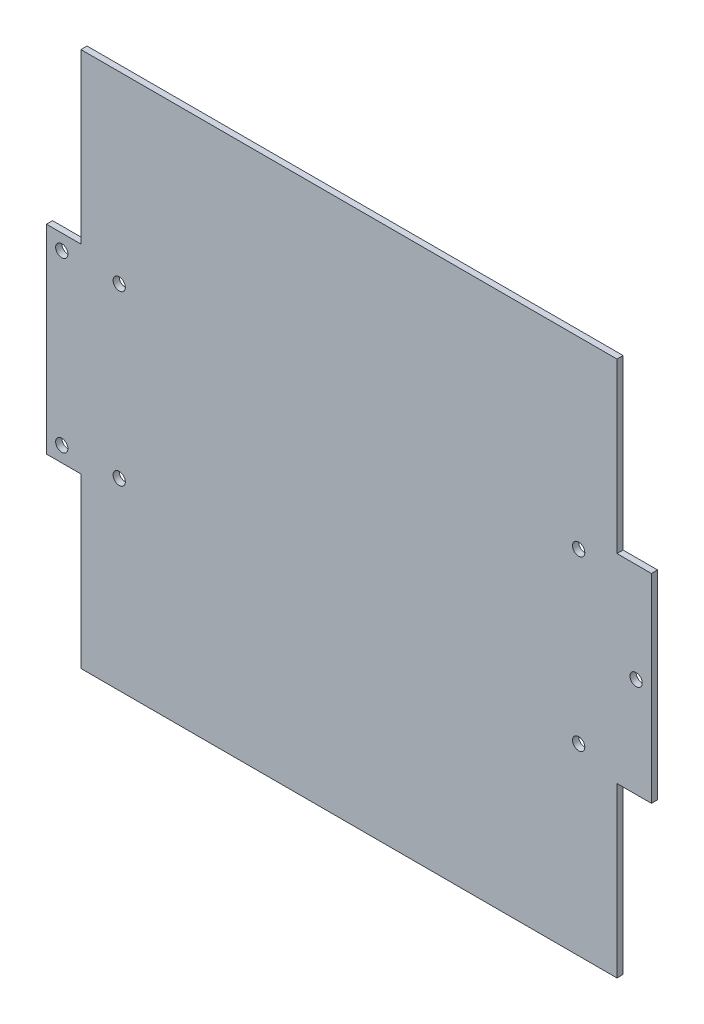
ISO-10303-21;
HEADER;
FILE_DESCRIPTION(('STEP AP214'),'2;1');
FILE_NAME('part.step','',(''),(''),'','','');
FILE_SCHEMA(('AUTOMOTIVE_DESIGN { 1 0 10303 214 1 1 1 1 }'));
ENDSEC;
DATA;
#1=APPLICATION_CONTEXT('core data for automotive mechanical design processes');
#2=APPLICATION_PROTOCOL_DEFINITION('international standard','automotive_design',2000,#1);
#3=PRODUCT_CONTEXT('',#1,'mechanical');
#4=PRODUCT('Part','Part','',(#3));
#5=PRODUCT_RELATED_PRODUCT_CATEGORY('part','',(#4));
#6=PRODUCT_DEFINITION_FORMATION('','',#4);
#7=PRODUCT_DEFINITION_CONTEXT('part definition',#1,'design');
#8=PRODUCT_DEFINITION('design','',#6,#7);
#9=PRODUCT_DEFINITION_SHAPE('','',#8);
#10=(LENGTH_UNIT() NAMED_UNIT(*) SI_UNIT(.MILLI.,.METRE.));
#11=(NAMED_UNIT(*) PLANE_ANGLE_UNIT() SI_UNIT($,.RADIAN.));
#12=(NAMED_UNIT(*) SI_UNIT($,.STERADIAN.) SOLID_ANGLE_UNIT());
#13=UNCERTAINTY_MEASURE_WITH_UNIT(LENGTH_MEASURE(1.E-05),#10,'distance_accuracy_value','');
#14=(GEOMETRIC_REPRESENTATION_CONTEXT(3) GLOBAL_UNCERTAINTY_ASSIGNED_CONTEXT((#13)) GLOBAL_UNIT_ASSIGNED_CONTEXT((#10,
#11,#12)) REPRESENTATION_CONTEXT('',''));
#15=CARTESIAN_POINT('',(0.,0.,0.));
#16=DIRECTION('',(0.,0.,1.));
#17=DIRECTION('',(1.,0.,0.));
#18=AXIS2_PLACEMENT_3D('',#15,#16,#17);
#19=CARTESIAN_POINT('',(0.,0.,1.6));
#20=DIRECTION('',(1.,0.,0.));
#21=DIRECTION('',(0.,1.,0.));
#22=AXIS2_PLACEMENT_3D('',#19,#20,#21);
#23=PLANE('',#22);
#24=DIRECTION('',(0.,-1.,0.));
#25=VECTOR('',#24,1.);
#26=CARTESIAN_POINT('',(0.,0.,0.));
#27=LINE('',#26,#25);
#28=CARTESIAN_POINT('',(0.,44.,0.));
#29=VERTEX_POINT('',#28);
#30=CARTESIAN_POINT('',(0.,0.,0.));
#31=VERTEX_POINT('',#30);
#32=EDGE_CURVE('E155',#29,#31,#27,.T.);
#33=ORIENTED_EDGE('',*,*,#32,.T.);
#34=DIRECTION('',(0.,0.,-1.));
#35=VECTOR('',#34,1.);
#36=CARTESIAN_POINT('',(0.,0.,1.6));
#37=LINE('',#36,#35);
#38=CARTESIAN_POINT('',(0.,0.,1.6));
#39=VERTEX_POINT('',#38);
#40=EDGE_CURVE('E11',#39,#31,#37,.T.);
#41=ORIENTED_EDGE('',*,*,#40,.F.);
#42=DIRECTION('',(0.,-1.,0.));
#43=VECTOR('',#42,1.);
#44=CARTESIAN_POINT('',(0.,0.,1.6));
#45=LINE('',#44,#43);
#46=CARTESIAN_POINT('',(0.,44.,1.6));
#47=VERTEX_POINT('',#46);
#48=EDGE_CURVE('E178',#47,#39,#45,.T.);
#49=ORIENTED_EDGE('',*,*,#48,.F.);
#50=DIRECTION('',(0.,0.,-1.));
#51=VECTOR('',#50,1.);
#52=CARTESIAN_POINT('',(0.,44.,1.6));
#53=LINE('',#52,#51);
#54=EDGE_CURVE('E151',#47,#29,#53,.T.);
#55=ORIENTED_EDGE('',*,*,#54,.T.);
#56=EDGE_LOOP('',(#33,#41,#49,#55));
#57=FACE_BOUND('',#56,.T.);
#58=ADVANCED_FACE('F35',(#57),#23,.F.);
#59=CARTESIAN_POINT('',(0.,0.,1.6));
#60=DIRECTION('',(0.,1.,0.));
#61=DIRECTION('',(-1.,0.,0.));
#62=AXIS2_PLACEMENT_3D('',#59,#60,#61);
#63=PLANE('',#62);
#64=DIRECTION('',(1.,0.,0.));
#65=VECTOR('',#64,1.);
#66=CARTESIAN_POINT('',(0.,0.,0.));
#67=LINE('',#66,#65);
#68=CARTESIAN_POINT('',(140.,0.,0.));
#69=VERTEX_POINT('',#68);
#70=EDGE_CURVE('E158',#31,#69,#67,.T.);
#71=ORIENTED_EDGE('',*,*,#70,.T.);
#72=DIRECTION('',(0.,0.,-1.));
#73=VECTOR('',#72,1.);
#74=CARTESIAN_POINT('',(140.,0.,1.6));
#75=LINE('',#74,#73);
#76=CARTESIAN_POINT('',(140.,0.,1.6));
#77=VERTEX_POINT('',#76);
#78=EDGE_CURVE('E43',#77,#69,#75,.T.);
#79=ORIENTED_EDGE('',*,*,#78,.F.);
#80=DIRECTION('',(1.,0.,0.));
#81=VECTOR('',#80,1.);
#82=CARTESIAN_POINT('',(0.,0.,1.6));
#83=LINE('',#82,#81);
#84=EDGE_CURVE('E106',#39,#77,#83,.T.);
#85=ORIENTED_EDGE('',*,*,#84,.F.);
#86=ORIENTED_EDGE('',*,*,#40,.T.);
#87=EDGE_LOOP('',(#71,#79,#85,#86));
#88=FACE_BOUND('',#87,.T.);
#89=ADVANCED_FACE('F257',(#88),#63,.F.);
#90=CARTESIAN_POINT('',(140.,0.,1.6));
#91=DIRECTION('',(-1.,0.,0.));
#92=DIRECTION('',(0.,0.,1.));
#93=AXIS2_PLACEMENT_3D('',#90,#91,#92);
#94=PLANE('',#93);
#95=DIRECTION('',(0.,1.,0.));
#96=VECTOR('',#95,1.);
#97=CARTESIAN_POINT('',(140.,0.,0.));
#98=LINE('',#97,#96);
#99=CARTESIAN_POINT('',(140.,44.,0.));
#100=VERTEX_POINT('',#99);
#101=EDGE_CURVE('E161',#69,#100,#98,.T.);
#102=ORIENTED_EDGE('',*,*,#101,.T.);
#103=DIRECTION('',(0.,0.,-1.));
#104=VECTOR('',#103,1.);
#105=CARTESIAN_POINT('',(140.,44.,1.6));
#106=LINE('',#105,#104);
#107=CARTESIAN_POINT('',(140.,44.,1.6));
#108=VERTEX_POINT('',#107);
#109=EDGE_CURVE('E197',#108,#100,#106,.T.);
#110=ORIENTED_EDGE('',*,*,#109,.F.);
#111=DIRECTION('',(0.,1.,0.));
#112=VECTOR('',#111,1.);
#113=CARTESIAN_POINT('',(140.,0.,1.6));
#114=LINE('',#113,#112);
#115=EDGE_CURVE('E205',#77,#108,#114,.T.);
#116=ORIENTED_EDGE('',*,*,#115,.F.);
#117=ORIENTED_EDGE('',*,*,#78,.T.);
#118=EDGE_LOOP('',(#102,#110,#116,#117));
#119=FACE_BOUND('',#118,.T.);
#120=ADVANCED_FACE('F203',(#119),#94,.F.);
#121=CARTESIAN_POINT('',(140.,44.,1.6));
#122=DIRECTION('',(0.,1.,0.));
#123=DIRECTION('',(-1.,0.,0.));
#124=AXIS2_PLACEMENT_3D('',#121,#122,#123);
#125=PLANE('',#124);
#126=DIRECTION('',(1.,0.,0.));
#127=VECTOR('',#126,1.);
#128=CARTESIAN_POINT('',(140.,44.,0.));
#129=LINE('',#128,#127);
#130=CARTESIAN_POINT('',(149.,44.,0.));
#131=VERTEX_POINT('',#130);
#132=EDGE_CURVE('E163',#100,#131,#129,.T.);
#133=ORIENTED_EDGE('',*,*,#132,.T.);
#134=DIRECTION('',(0.,0.,-1.));
#135=VECTOR('',#134,1.);
#136=CARTESIAN_POINT('',(149.,44.,1.6));
#137=LINE('',#136,#135);
#138=CARTESIAN_POINT('',(149.,44.,1.6));
#139=VERTEX_POINT('',#138);
#140=EDGE_CURVE('E194',#139,#131,#137,.T.);
#141=ORIENTED_EDGE('',*,*,#140,.F.);
#142=DIRECTION('',(1.,0.,0.));
#143=VECTOR('',#142,1.);
#144=CARTESIAN_POINT('',(140.,44.,1.6));
#145=LINE('',#144,#143);
#146=EDGE_CURVE('E223',#108,#139,#145,.T.);
#147=ORIENTED_EDGE('',*,*,#146,.F.);
#148=ORIENTED_EDGE('',*,*,#109,.T.);
#149=EDGE_LOOP('',(#133,#141,#147,#148));
#150=FACE_BOUND('',#149,.T.);
#151=ADVANCED_FACE('F214',(#150),#125,.F.);
#152=CARTESIAN_POINT('',(149.,44.,1.6));
#153=DIRECTION('',(-1.,0.,0.));
#154=DIRECTION('',(0.,0.,1.));
#155=AXIS2_PLACEMENT_3D('',#152,#153,#154);
#156=PLANE('',#155);
#157=DIRECTION('',(0.,1.,0.));
#158=VECTOR('',#157,1.);
#159=CARTESIAN_POINT('',(149.,44.,0.));
#160=LINE('',#159,#158);
#161=CARTESIAN_POINT('',(149.,96.,0.));
#162=VERTEX_POINT('',#161);
#163=EDGE_CURVE('E165',#131,#162,#160,.T.);
#164=ORIENTED_EDGE('',*,*,#163,.T.);
#165=DIRECTION('',(0.,0.,-1.));
#166=VECTOR('',#165,1.);
#167=CARTESIAN_POINT('',(149.,96.,1.6));
#168=LINE('',#167,#166);
#169=CARTESIAN_POINT('',(149.,96.,1.6));
#170=VERTEX_POINT('',#169);
#171=EDGE_CURVE('E191',#170,#162,#168,.T.);
#172=ORIENTED_EDGE('',*,*,#171,.F.);
#173=DIRECTION('',(0.,1.,0.));
#174=VECTOR('',#173,1.);
#175=CARTESIAN_POINT('',(149.,44.,1.6));
#176=LINE('',#175,#174);
#177=EDGE_CURVE('E220',#139,#170,#176,.T.);
#178=ORIENTED_EDGE('',*,*,#177,.F.);
#179=ORIENTED_EDGE('',*,*,#140,.T.);
#180=EDGE_LOOP('',(#164,#172,#178,#179));
#181=FACE_BOUND('',#180,.T.);
#182=ADVANCED_FACE('F218',(#181),#156,.F.);
#183=CARTESIAN_POINT('',(149.,96.,1.6));
#184=DIRECTION('',(0.,-1.,0.));
#185=DIRECTION('',(0.,0.,-1.));
#186=AXIS2_PLACEMENT_3D('',#183,#184,#185);
#187=PLANE('',#186);
#188=DIRECTION('',(-1.,0.,0.));
#189=VECTOR('',#188,1.);
#190=CARTESIAN_POINT('',(149.,96.,0.));
#191=LINE('',#190,#189);
#192=CARTESIAN_POINT('',(140.,96.,0.));
#193=VERTEX_POINT('',#192);
#194=EDGE_CURVE('E167',#162,#193,#191,.T.);
#195=ORIENTED_EDGE('',*,*,#194,.T.);
#196=DIRECTION('',(0.,0.,-1.));
#197=VECTOR('',#196,1.);
#198=CARTESIAN_POINT('',(140.,96.,1.6));
#199=LINE('',#198,#197);
#200=CARTESIAN_POINT('',(140.,96.,1.6));
#201=VERTEX_POINT('',#200);
#202=EDGE_CURVE('E188',#201,#193,#199,.T.);
#203=ORIENTED_EDGE('',*,*,#202,.F.);
#204=DIRECTION('',(-1.,0.,0.));
#205=VECTOR('',#204,1.);
#206=CARTESIAN_POINT('',(149.,96.,1.6));
#207=LINE('',#206,#205);
#208=EDGE_CURVE('E222',#170,#201,#207,.T.);
#209=ORIENTED_EDGE('',*,*,#208,.F.);
#210=ORIENTED_EDGE('',*,*,#171,.T.);
#211=EDGE_LOOP('',(#195,#203,#209,#210));
#212=FACE_BOUND('',#211,.T.);
#213=ADVANCED_FACE('F270',(#212),#187,.F.);
#214=CARTESIAN_POINT('',(140.,96.,1.6));
#215=DIRECTION('',(-1.,0.,0.));
#216=DIRECTION('',(0.,-1.,0.));
#217=AXIS2_PLACEMENT_3D('',#214,#215,#216);
#218=PLANE('',#217);
#219=DIRECTION('',(0.,1.,0.));
#220=VECTOR('',#219,1.);
#221=CARTESIAN_POINT('',(140.,96.,0.));
#222=LINE('',#221,#220);
#223=CARTESIAN_POINT('',(140.,140.,0.));
#224=VERTEX_POINT('',#223);
#225=EDGE_CURVE('E169',#193,#224,#222,.T.);
#226=ORIENTED_EDGE('',*,*,#225,.T.);
#227=DIRECTION('',(0.,0.,-1.));
#228=VECTOR('',#227,1.);
#229=CARTESIAN_POINT('',(140.,140.,1.6));
#230=LINE('',#229,#228);
#231=CARTESIAN_POINT('',(140.,140.,1.6));
#232=VERTEX_POINT('',#231);
#233=EDGE_CURVE('E185',#232,#224,#230,.T.);
#234=ORIENTED_EDGE('',*,*,#233,.F.);
#235=DIRECTION('',(0.,1.,0.));
#236=VECTOR('',#235,1.);
#237=CARTESIAN_POINT('',(140.,96.,1.6));
#238=LINE('',#237,#236);
#239=EDGE_CURVE('E225',#201,#232,#238,.T.);
#240=ORIENTED_EDGE('',*,*,#239,.F.);
#241=ORIENTED_EDGE('',*,*,#202,.T.);
#242=EDGE_LOOP('',(#226,#234,#240,#241));
#243=FACE_BOUND('',#242,.T.);
#244=ADVANCED_FACE('F273',(#243),#218,.F.);
#245=CARTESIAN_POINT('',(0.,140.,1.6));
#246=DIRECTION('',(0.,-1.,0.));
#247=DIRECTION('',(0.,0.,-1.));
#248=AXIS2_PLACEMENT_3D('',#245,#246,#247);
#249=PLANE('',#248);
#250=DIRECTION('',(-1.,0.,0.));
#251=VECTOR('',#250,1.);
#252=CARTESIAN_POINT('',(0.,140.,0.));
#253=LINE('',#252,#251);
#254=CARTESIAN_POINT('',(0.,140.,0.));
#255=VERTEX_POINT('',#254);
#256=EDGE_CURVE('E171',#224,#255,#253,.T.);
#257=ORIENTED_EDGE('',*,*,#256,.T.);
#258=DIRECTION('',(0.,0.,-1.));
#259=VECTOR('',#258,1.);
#260=CARTESIAN_POINT('',(0.,140.,1.6));
#261=LINE('',#260,#259);
#262=CARTESIAN_POINT('',(0.,140.,1.6));
#263=VERTEX_POINT('',#262);
#264=EDGE_CURVE('E182',#263,#255,#261,.T.);
#265=ORIENTED_EDGE('',*,*,#264,.F.);
#266=DIRECTION('',(-1.,0.,0.));
#267=VECTOR('',#266,1.);
#268=CARTESIAN_POINT('',(0.,140.,1.6));
#269=LINE('',#268,#267);
#270=EDGE_CURVE('E231',#232,#263,#269,.T.);
#271=ORIENTED_EDGE('',*,*,#270,.F.);
#272=ORIENTED_EDGE('',*,*,#233,.T.);
#273=EDGE_LOOP('',(#257,#265,#271,#272));
#274=FACE_BOUND('',#273,.T.);
#275=ADVANCED_FACE('F237',(#274),#249,.F.);
#276=CARTESIAN_POINT('',(0.,96.,1.6));
#277=DIRECTION('',(1.,0.,0.));
#278=DIRECTION('',(0.,0.,-1.));
#279=AXIS2_PLACEMENT_3D('',#276,#277,#278);
#280=PLANE('',#279);
#281=DIRECTION('',(0.,-1.,0.));
#282=VECTOR('',#281,1.);
#283=CARTESIAN_POINT('',(0.,96.,0.));
#284=LINE('',#283,#282);
#285=CARTESIAN_POINT('',(0.,96.,0.));
#286=VERTEX_POINT('',#285);
#287=EDGE_CURVE('E173',#255,#286,#284,.T.);
#288=ORIENTED_EDGE('',*,*,#287,.T.);
#289=DIRECTION('',(0.,0.,-1.));
#290=VECTOR('',#289,1.);
#291=CARTESIAN_POINT('',(0.,96.,1.6));
#292=LINE('',#291,#290);
#293=CARTESIAN_POINT('',(0.,96.,1.6));
#294=VERTEX_POINT('',#293);
#295=EDGE_CURVE('E146',#294,#286,#292,.T.);
#296=ORIENTED_EDGE('',*,*,#295,.F.);
#297=DIRECTION('',(0.,-1.,0.));
#298=VECTOR('',#297,1.);
#299=CARTESIAN_POINT('',(0.,96.,1.6));
#300=LINE('',#299,#298);
#301=EDGE_CURVE('E137',#263,#294,#300,.T.);
#302=ORIENTED_EDGE('',*,*,#301,.F.);
#303=ORIENTED_EDGE('',*,*,#264,.T.);
#304=EDGE_LOOP('',(#288,#296,#302,#303));
#305=FACE_BOUND('',#304,.T.);
#306=ADVANCED_FACE('F241',(#305),#280,.F.);
#307=CARTESIAN_POINT('',(0.,96.,1.6));
#308=DIRECTION('',(0.,-1.,0.));
#309=DIRECTION('',(1.,0.,0.));
#310=AXIS2_PLACEMENT_3D('',#307,#308,#309);
#311=PLANE('',#310);
#312=DIRECTION('',(-1.,0.,0.));
#313=VECTOR('',#312,1.);
#314=CARTESIAN_POINT('',(0.,96.,0.));
#315=LINE('',#314,#313);
#316=CARTESIAN_POINT('',(-9.,96.,0.));
#317=VERTEX_POINT('',#316);
#318=EDGE_CURVE('E145',#286,#317,#315,.T.);
#319=ORIENTED_EDGE('',*,*,#318,.T.);
#320=DIRECTION('',(0.,0.,-1.));
#321=VECTOR('',#320,1.);
#322=CARTESIAN_POINT('',(-9.,96.,1.6));
#323=LINE('',#322,#321);
#324=CARTESIAN_POINT('',(-9.,96.,1.6));
#325=VERTEX_POINT('',#324);
#326=EDGE_CURVE('E142',#325,#317,#323,.T.);
#327=ORIENTED_EDGE('',*,*,#326,.F.);
#328=DIRECTION('',(-1.,0.,0.));
#329=VECTOR('',#328,1.);
#330=CARTESIAN_POINT('',(0.,96.,1.6));
#331=LINE('',#330,#329);
#332=EDGE_CURVE('E131',#294,#325,#331,.T.);
#333=ORIENTED_EDGE('',*,*,#332,.F.);
#334=ORIENTED_EDGE('',*,*,#295,.T.);
#335=EDGE_LOOP('',(#319,#327,#333,#334));
#336=FACE_BOUND('',#335,.T.);
#337=ADVANCED_FACE('F143',(#336),#311,.F.);
#338=CARTESIAN_POINT('',(-9.,96.,1.6));
#339=DIRECTION('',(1.,0.,0.));
#340=DIRECTION('',(0.,1.,0.));
#341=AXIS2_PLACEMENT_3D('',#338,#339,#340);
#342=PLANE('',#341);
#343=DIRECTION('',(0.,-1.,0.));
#344=VECTOR('',#343,1.);
#345=CARTESIAN_POINT('',(-9.,96.,0.));
#346=LINE('',#345,#344);
#347=CARTESIAN_POINT('',(-8.99999999999999,44.,0.));
#348=VERTEX_POINT('',#347);
#349=EDGE_CURVE('E92',#317,#348,#346,.T.);
#350=ORIENTED_EDGE('',*,*,#349,.T.);
#351=DIRECTION('',(0.,0.,-1.));
#352=VECTOR('',#351,1.);
#353=CARTESIAN_POINT('',(-8.99999999999999,44.,1.6));
#354=LINE('',#353,#352);
#355=CARTESIAN_POINT('',(-8.99999999999999,44.,1.6));
#356=VERTEX_POINT('',#355);
#357=EDGE_CURVE('E147',#356,#348,#354,.T.);
#358=ORIENTED_EDGE('',*,*,#357,.F.);
#359=DIRECTION('',(0.,-1.,0.));
#360=VECTOR('',#359,1.);
#361=CARTESIAN_POINT('',(-9.,96.,1.6));
#362=LINE('',#361,#360);
#363=EDGE_CURVE('E135',#325,#356,#362,.T.);
#364=ORIENTED_EDGE('',*,*,#363,.F.);
#365=ORIENTED_EDGE('',*,*,#326,.T.);
#366=EDGE_LOOP('',(#350,#358,#364,#365));
#367=FACE_BOUND('',#366,.T.);
#368=ADVANCED_FACE('F149',(#367),#342,.F.);
#369=CARTESIAN_POINT('',(-8.99999999999999,44.,1.6));
#370=DIRECTION('',(0.,1.,0.));
#371=DIRECTION('',(-1.,0.,0.));
#372=AXIS2_PLACEMENT_3D('',#369,#370,#371);
#373=PLANE('',#372);
#374=DIRECTION('',(1.,0.,0.));
#375=VECTOR('',#374,1.);
#376=CARTESIAN_POINT('',(-8.99999999999999,44.,0.));
#377=LINE('',#376,#375);
#378=EDGE_CURVE('E98',#348,#29,#377,.T.);
#379=ORIENTED_EDGE('',*,*,#378,.T.);
#380=ORIENTED_EDGE('',*,*,#54,.F.);
#381=DIRECTION('',(1.,0.,0.));
#382=VECTOR('',#381,1.);
#383=CARTESIAN_POINT('',(-8.99999999999999,44.,1.6));
#384=LINE('',#383,#382);
#385=EDGE_CURVE('E51',#356,#47,#384,.T.);
#386=ORIENTED_EDGE('',*,*,#385,.F.);
#387=ORIENTED_EDGE('',*,*,#357,.T.);
#388=EDGE_LOOP('',(#379,#380,#386,#387));
#389=FACE_BOUND('',#388,.T.);
#390=ADVANCED_FACE('F245',(#389),#373,.F.);
#391=CARTESIAN_POINT('',(0.,44.,1.6));
#392=DIRECTION('',(0.,0.,-1.));
#393=DIRECTION('',(-1.,0.,0.));
#394=AXIS2_PLACEMENT_3D('',#391,#392,#393);
#395=PLANE('',#394);
#396=CARTESIAN_POINT('',(145.,70.,1.6));
#397=DIRECTION('',(0.,0.,1.));
#398=DIRECTION('',(1.,0.,0.));
#399=AXIS2_PLACEMENT_3D('',#396,#397,#398);
#400=CIRCLE('',#399,1.59999999999999);
#401=CARTESIAN_POINT('',(146.6,70.,1.6));
#402=VERTEX_POINT('',#401);
#403=EDGE_CURVE('E389',#402,#402,#400,.T.);
#404=ORIENTED_EDGE('',*,*,#403,.F.);
#405=EDGE_LOOP('',(#404));
#406=FACE_BOUND('',#405,.T.);
#407=CARTESIAN_POINT('',(-4.99999999999996,48.,1.6));
#408=DIRECTION('',(0.,0.,1.));
#409=DIRECTION('',(1.,0.,0.));
#410=AXIS2_PLACEMENT_3D('',#407,#408,#409);
#411=CIRCLE('',#410,1.6);
#412=CARTESIAN_POINT('',(-3.39999999999996,48.,1.6));
#413=VERTEX_POINT('',#412);
#414=EDGE_CURVE('E391',#413,#413,#411,.T.);
#415=ORIENTED_EDGE('',*,*,#414,.F.);
#416=EDGE_LOOP('',(#415));
#417=FACE_BOUND('',#416,.T.);
#418=CARTESIAN_POINT('',(-4.99999999999997,92.,1.6));
#419=DIRECTION('',(0.,0.,1.));
#420=DIRECTION('',(1.,0.,0.));
#421=AXIS2_PLACEMENT_3D('',#418,#419,#420);
#422=CIRCLE('',#421,1.6);
#423=CARTESIAN_POINT('',(-3.39999999999997,92.,1.6));
#424=VERTEX_POINT('',#423);
#425=EDGE_CURVE('E397',#424,#424,#422,.T.);
#426=ORIENTED_EDGE('',*,*,#425,.F.);
#427=EDGE_LOOP('',(#426));
#428=FACE_BOUND('',#427,.T.);
#429=CARTESIAN_POINT('',(130.,92.,1.6));
#430=DIRECTION('',(0.,0.,-1.));
#431=DIRECTION('',(-1.,0.,0.));
#432=AXIS2_PLACEMENT_3D('',#429,#430,#431);
#433=CIRCLE('',#432,1.59999999999999);
#434=CARTESIAN_POINT('',(128.4,92.,1.6));
#435=VERTEX_POINT('',#434);
#436=EDGE_CURVE('E408',#435,#435,#433,.T.);
#437=ORIENTED_EDGE('',*,*,#436,.T.);
#438=EDGE_LOOP('',(#437));
#439=FACE_BOUND('',#438,.T.);
#440=CARTESIAN_POINT('',(130.,48.,1.6));
#441=DIRECTION('',(0.,0.,-1.));
#442=DIRECTION('',(-1.,0.,0.));
#443=AXIS2_PLACEMENT_3D('',#440,#441,#442);
#444=CIRCLE('',#443,1.59999999999999);
#445=CARTESIAN_POINT('',(128.4,48.,1.6));
#446=VERTEX_POINT('',#445);
#447=EDGE_CURVE('E414',#446,#446,#444,.T.);
#448=ORIENTED_EDGE('',*,*,#447,.T.);
#449=EDGE_LOOP('',(#448));
#450=FACE_BOUND('',#449,.T.);
#451=CARTESIAN_POINT('',(10.,92.,1.6));
#452=DIRECTION('',(0.,0.,-1.));
#453=DIRECTION('',(-1.,0.,0.));
#454=AXIS2_PLACEMENT_3D('',#451,#452,#453);
#455=CIRCLE('',#454,1.6);
#456=CARTESIAN_POINT('',(8.40000000000005,92.,1.6));
#457=VERTEX_POINT('',#456);
#458=EDGE_CURVE('E420',#457,#457,#455,.T.);
#459=ORIENTED_EDGE('',*,*,#458,.T.);
#460=EDGE_LOOP('',(#459));
#461=FACE_BOUND('',#460,.T.);
#462=CARTESIAN_POINT('',(10.,48.,1.6));
#463=DIRECTION('',(0.,0.,-1.));
#464=DIRECTION('',(-1.,0.,0.));
#465=AXIS2_PLACEMENT_3D('',#462,#463,#464);
#466=CIRCLE('',#465,1.6);
#467=CARTESIAN_POINT('',(8.40000000000004,48.,1.6));
#468=VERTEX_POINT('',#467);
#469=EDGE_CURVE('E159',#468,#468,#466,.T.);
#470=ORIENTED_EDGE('',*,*,#469,.T.);
#471=EDGE_LOOP('',(#470));
#472=FACE_BOUND('',#471,.T.);
#473=ORIENTED_EDGE('',*,*,#48,.T.);
#474=ORIENTED_EDGE('',*,*,#84,.T.);
#475=ORIENTED_EDGE('',*,*,#115,.T.);
#476=ORIENTED_EDGE('',*,*,#146,.T.);
#477=ORIENTED_EDGE('',*,*,#177,.T.);
#478=ORIENTED_EDGE('',*,*,#208,.T.);
#479=ORIENTED_EDGE('',*,*,#239,.T.);
#480=ORIENTED_EDGE('',*,*,#270,.T.);
#481=ORIENTED_EDGE('',*,*,#301,.T.);
#482=ORIENTED_EDGE('',*,*,#332,.T.);
#483=ORIENTED_EDGE('',*,*,#363,.T.);
#484=ORIENTED_EDGE('',*,*,#385,.T.);
#485=EDGE_LOOP('',(#473,#474,#475,#476,#477,#478,#479,#480,#481,#482,#483,#484));
#486=FACE_BOUND('',#485,.T.);
#487=ADVANCED_FACE('F133',(#406,#417,#428,#439,#450,#461,#472,#486),#395,.F.);
#488=CARTESIAN_POINT('',(0.,44.,0.));
#489=DIRECTION('',(0.,0.,-1.));
#490=DIRECTION('',(-1.,0.,0.));
#491=AXIS2_PLACEMENT_3D('',#488,#489,#490);
#492=PLANE('',#491);
#493=CARTESIAN_POINT('',(145.,70.,0.));
#494=DIRECTION('',(0.,0.,1.));
#495=DIRECTION('',(1.,0.,0.));
#496=AXIS2_PLACEMENT_3D('',#493,#494,#495);
#497=CIRCLE('',#496,1.59999999999999);
#498=CARTESIAN_POINT('',(146.6,70.,0.));
#499=VERTEX_POINT('',#498);
#500=EDGE_CURVE('E386',#499,#499,#497,.T.);
#501=ORIENTED_EDGE('',*,*,#500,.T.);
#502=EDGE_LOOP('',(#501));
#503=FACE_BOUND('',#502,.T.);
#504=CARTESIAN_POINT('',(-4.99999999999996,48.,0.));
#505=DIRECTION('',(0.,0.,1.));
#506=DIRECTION('',(1.,0.,0.));
#507=AXIS2_PLACEMENT_3D('',#504,#505,#506);
#508=CIRCLE('',#507,1.6);
#509=CARTESIAN_POINT('',(-3.39999999999996,48.,0.));
#510=VERTEX_POINT('',#509);
#511=EDGE_CURVE('E394',#510,#510,#508,.T.);
#512=ORIENTED_EDGE('',*,*,#511,.T.);
#513=EDGE_LOOP('',(#512));
#514=FACE_BOUND('',#513,.T.);
#515=CARTESIAN_POINT('',(-4.99999999999997,92.,0.));
#516=DIRECTION('',(0.,0.,1.));
#517=DIRECTION('',(1.,0.,0.));
#518=AXIS2_PLACEMENT_3D('',#515,#516,#517);
#519=CIRCLE('',#518,1.6);
#520=CARTESIAN_POINT('',(-3.39999999999997,92.,0.));
#521=VERTEX_POINT('',#520);
#522=EDGE_CURVE('E400',#521,#521,#519,.T.);
#523=ORIENTED_EDGE('',*,*,#522,.T.);
#524=EDGE_LOOP('',(#523));
#525=FACE_BOUND('',#524,.T.);
#526=CARTESIAN_POINT('',(130.,92.,0.));
#527=DIRECTION('',(0.,0.,-1.));
#528=DIRECTION('',(-1.,0.,0.));
#529=AXIS2_PLACEMENT_3D('',#526,#527,#528);
#530=CIRCLE('',#529,1.59999999999999);
#531=CARTESIAN_POINT('',(128.4,92.,0.));
#532=VERTEX_POINT('',#531);
#533=EDGE_CURVE('E403',#532,#532,#530,.T.);
#534=ORIENTED_EDGE('',*,*,#533,.F.);
#535=EDGE_LOOP('',(#534));
#536=FACE_BOUND('',#535,.T.);
#537=CARTESIAN_POINT('',(130.,48.,0.));
#538=DIRECTION('',(0.,0.,-1.));
#539=DIRECTION('',(-1.,0.,0.));
#540=AXIS2_PLACEMENT_3D('',#537,#538,#539);
#541=CIRCLE('',#540,1.59999999999999);
#542=CARTESIAN_POINT('',(128.4,48.,0.));
#543=VERTEX_POINT('',#542);
#544=EDGE_CURVE('E411',#543,#543,#541,.T.);
#545=ORIENTED_EDGE('',*,*,#544,.F.);
#546=EDGE_LOOP('',(#545));
#547=FACE_BOUND('',#546,.T.);
#548=CARTESIAN_POINT('',(10.,92.,0.));
#549=DIRECTION('',(0.,0.,-1.));
#550=DIRECTION('',(-1.,0.,0.));
#551=AXIS2_PLACEMENT_3D('',#548,#549,#550);
#552=CIRCLE('',#551,1.6);
#553=CARTESIAN_POINT('',(8.40000000000005,92.,0.));
#554=VERTEX_POINT('',#553);
#555=EDGE_CURVE('E417',#554,#554,#552,.T.);
#556=ORIENTED_EDGE('',*,*,#555,.F.);
#557=EDGE_LOOP('',(#556));
#558=FACE_BOUND('',#557,.T.);
#559=CARTESIAN_POINT('',(10.,48.,0.));
#560=DIRECTION('',(0.,0.,-1.));
#561=DIRECTION('',(-1.,0.,0.));
#562=AXIS2_PLACEMENT_3D('',#559,#560,#561);
#563=CIRCLE('',#562,1.6);
#564=CARTESIAN_POINT('',(8.40000000000004,48.,0.));
#565=VERTEX_POINT('',#564);
#566=EDGE_CURVE('E423',#565,#565,#563,.T.);
#567=ORIENTED_EDGE('',*,*,#566,.F.);
#568=EDGE_LOOP('',(#567));
#569=FACE_BOUND('',#568,.T.);
#570=ORIENTED_EDGE('',*,*,#32,.F.);
#571=ORIENTED_EDGE('',*,*,#378,.F.);
#572=ORIENTED_EDGE('',*,*,#349,.F.);
#573=ORIENTED_EDGE('',*,*,#318,.F.);
#574=ORIENTED_EDGE('',*,*,#287,.F.);
#575=ORIENTED_EDGE('',*,*,#256,.F.);
#576=ORIENTED_EDGE('',*,*,#225,.F.);
#577=ORIENTED_EDGE('',*,*,#194,.F.);
#578=ORIENTED_EDGE('',*,*,#163,.F.);
#579=ORIENTED_EDGE('',*,*,#132,.F.);
#580=ORIENTED_EDGE('',*,*,#101,.F.);
#581=ORIENTED_EDGE('',*,*,#70,.F.);
#582=EDGE_LOOP('',(#570,#571,#572,#573,#574,#575,#576,#577,#578,#579,#580,#581));
#583=FACE_BOUND('',#582,.T.);
#584=ADVANCED_FACE('F209',(#503,#514,#525,#536,#547,#558,#569,#583),#492,.T.);
#585=CARTESIAN_POINT('',(10.,48.,0.));
#586=DIRECTION('',(0.,0.,-1.));
#587=DIRECTION('',(-1.,0.,0.));
#588=AXIS2_PLACEMENT_3D('',#585,#586,#587);
#589=CYLINDRICAL_SURFACE('',#588,1.6);
#590=ORIENTED_EDGE('',*,*,#566,.T.);
#591=EDGE_LOOP('',(#590));
#592=FACE_BOUND('',#591,.T.);
#593=ORIENTED_EDGE('',*,*,#469,.F.);
#594=EDGE_LOOP('',(#593));
#595=FACE_BOUND('',#594,.T.);
#596=ADVANCED_FACE('F301',(#592,#595),#589,.F.);
#597=CARTESIAN_POINT('',(10.,92.,0.));
#598=DIRECTION('',(0.,0.,-1.));
#599=DIRECTION('',(-1.,0.,0.));
#600=AXIS2_PLACEMENT_3D('',#597,#598,#599);
#601=CYLINDRICAL_SURFACE('',#600,1.6);
#602=ORIENTED_EDGE('',*,*,#555,.T.);
#603=EDGE_LOOP('',(#602));
#604=FACE_BOUND('',#603,.T.);
#605=ORIENTED_EDGE('',*,*,#458,.F.);
#606=EDGE_LOOP('',(#605));
#607=FACE_BOUND('',#606,.T.);
#608=ADVANCED_FACE('F306',(#604,#607),#601,.F.);
#609=CARTESIAN_POINT('',(130.,48.,0.));
#610=DIRECTION('',(0.,0.,-1.));
#611=DIRECTION('',(-1.,0.,0.));
#612=AXIS2_PLACEMENT_3D('',#609,#610,#611);
#613=CYLINDRICAL_SURFACE('',#612,1.59999999999999);
#614=ORIENTED_EDGE('',*,*,#544,.T.);
#615=EDGE_LOOP('',(#614));
#616=FACE_BOUND('',#615,.T.);
#617=ORIENTED_EDGE('',*,*,#447,.F.);
#618=EDGE_LOOP('',(#617));
#619=FACE_BOUND('',#618,.T.);
#620=ADVANCED_FACE('F318',(#616,#619),#613,.F.);
#621=CARTESIAN_POINT('',(130.,92.,0.));
#622=DIRECTION('',(0.,0.,-1.));
#623=DIRECTION('',(-1.,0.,0.));
#624=AXIS2_PLACEMENT_3D('',#621,#622,#623);
#625=CYLINDRICAL_SURFACE('',#624,1.59999999999999);
#626=ORIENTED_EDGE('',*,*,#533,.T.);
#627=EDGE_LOOP('',(#626));
#628=FACE_BOUND('',#627,.T.);
#629=ORIENTED_EDGE('',*,*,#436,.F.);
#630=EDGE_LOOP('',(#629));
#631=FACE_BOUND('',#630,.T.);
#632=ADVANCED_FACE('F328',(#628,#631),#625,.F.);
#633=CARTESIAN_POINT('',(-4.99999999999997,92.,0.));
#634=DIRECTION('',(0.,0.,1.));
#635=DIRECTION('',(1.,0.,0.));
#636=AXIS2_PLACEMENT_3D('',#633,#634,#635);
#637=CYLINDRICAL_SURFACE('',#636,1.6);
#638=ORIENTED_EDGE('',*,*,#522,.F.);
#639=EDGE_LOOP('',(#638));
#640=FACE_BOUND('',#639,.T.);
#641=ORIENTED_EDGE('',*,*,#425,.T.);
#642=EDGE_LOOP('',(#641));
#643=FACE_BOUND('',#642,.T.);
#644=ADVANCED_FACE('F338',(#640,#643),#637,.F.);
#645=CARTESIAN_POINT('',(-4.99999999999996,48.,0.));
#646=DIRECTION('',(0.,0.,1.));
#647=DIRECTION('',(1.,0.,0.));
#648=AXIS2_PLACEMENT_3D('',#645,#646,#647);
#649=CYLINDRICAL_SURFACE('',#648,1.6);
#650=ORIENTED_EDGE('',*,*,#511,.F.);
#651=EDGE_LOOP('',(#650));
#652=FACE_BOUND('',#651,.T.);
#653=ORIENTED_EDGE('',*,*,#414,.T.);
#654=EDGE_LOOP('',(#653));
#655=FACE_BOUND('',#654,.T.);
#656=ADVANCED_FACE('F359',(#652,#655),#649,.F.);
#657=CARTESIAN_POINT('',(145.,70.,0.));
#658=DIRECTION('',(0.,0.,1.));
#659=DIRECTION('',(1.,0.,0.));
#660=AXIS2_PLACEMENT_3D('',#657,#658,#659);
#661=CYLINDRICAL_SURFACE('',#660,1.59999999999999);
#662=ORIENTED_EDGE('',*,*,#500,.F.);
#663=EDGE_LOOP('',(#662));
#664=FACE_BOUND('',#663,.T.);
#665=ORIENTED_EDGE('',*,*,#403,.T.);
#666=EDGE_LOOP('',(#665));
#667=FACE_BOUND('',#666,.T.);
#668=ADVANCED_FACE('F369',(#664,#667),#661,.F.);
#669=CLOSED_SHELL('',(#58,#89,#120,#151,#182,#213,#244,#275,#306,#337,#368,#390,#487,#584,#596,
#608,#620,#632,#644,#656,#668));
#670=MANIFOLD_SOLID_BREP('B2',#669);
#671=ADVANCED_BREP_SHAPE_REPRESENTATION('',(#18,#670),#14);
#672=SHAPE_DEFINITION_REPRESENTATION(#9,#671);
ENDSEC;
END-ISO-10303-21;
